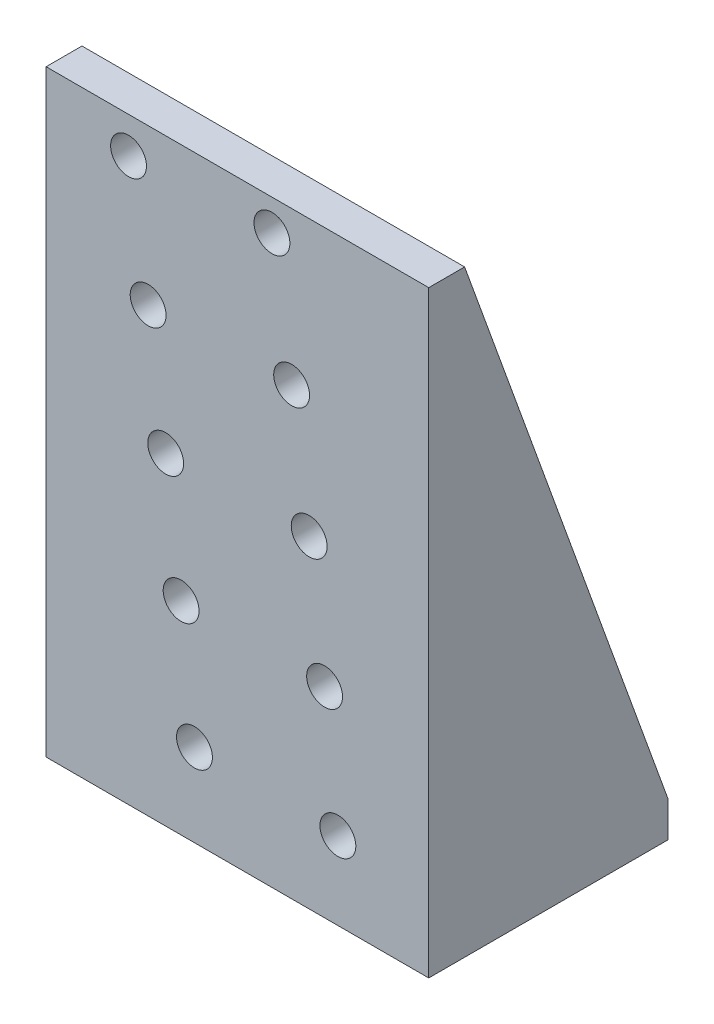
ISO-10303-21;
HEADER;
FILE_DESCRIPTION(('STEP AP214'),'2;1');
FILE_NAME('part.step','',(''),(''),'','','');
FILE_SCHEMA(('AUTOMOTIVE_DESIGN { 1 0 10303 214 1 1 1 1 }'));
ENDSEC;
DATA;
#1=APPLICATION_CONTEXT('core data for automotive mechanical design processes');
#2=APPLICATION_PROTOCOL_DEFINITION('international standard','automotive_design',2000,#1);
#3=PRODUCT_CONTEXT('',#1,'mechanical');
#4=PRODUCT('Part','Part','',(#3));
#5=PRODUCT_RELATED_PRODUCT_CATEGORY('part','',(#4));
#6=PRODUCT_DEFINITION_FORMATION('','',#4);
#7=PRODUCT_DEFINITION_CONTEXT('part definition',#1,'design');
#8=PRODUCT_DEFINITION('design','',#6,#7);
#9=PRODUCT_DEFINITION_SHAPE('','',#8);
#10=(LENGTH_UNIT() NAMED_UNIT(*) SI_UNIT(.MILLI.,.METRE.));
#11=(NAMED_UNIT(*) PLANE_ANGLE_UNIT() SI_UNIT($,.RADIAN.));
#12=(NAMED_UNIT(*) SI_UNIT($,.STERADIAN.) SOLID_ANGLE_UNIT());
#13=UNCERTAINTY_MEASURE_WITH_UNIT(LENGTH_MEASURE(1.E-05),#10,'distance_accuracy_value','');
#14=(GEOMETRIC_REPRESENTATION_CONTEXT(3) GLOBAL_UNCERTAINTY_ASSIGNED_CONTEXT((#13)) GLOBAL_UNIT_ASSIGNED_CONTEXT((#10,
#11,#12)) REPRESENTATION_CONTEXT('',''));
#15=CARTESIAN_POINT('',(0.,0.,0.));
#16=DIRECTION('',(0.,0.,1.));
#17=DIRECTION('',(1.,0.,0.));
#18=AXIS2_PLACEMENT_3D('',#15,#16,#17);
#19=CARTESIAN_POINT('',(0.,0.,-3.));
#20=DIRECTION('',(0.,0.,-1.));
#21=DIRECTION('',(1.,0.,0.));
#22=AXIS2_PLACEMENT_3D('',#19,#20,#21);
#23=PLANE('',#22);
#24=CARTESIAN_POINT('',(-9.10672553053666,19.9841864417442,-3.));
#25=DIRECTION('',(0.,0.,1.));
#26=DIRECTION('',(1.,0.,0.));
#27=AXIS2_PLACEMENT_3D('',#24,#25,#26);
#28=CIRCLE('',#27,1.5);
#29=CARTESIAN_POINT('',(-7.60672553053666,19.9841864417442,-3.));
#30=VERTEX_POINT('',#29);
#31=EDGE_CURVE('E197',#30,#30,#28,.T.);
#32=ORIENTED_EDGE('',*,*,#31,.T.);
#33=EDGE_LOOP('',(#32));
#34=FACE_BOUND('',#33,.T.);
#35=CARTESIAN_POINT('',(8.40008487268782,-20.4992297331571,-3.));
#36=DIRECTION('',(0.,0.,1.));
#37=DIRECTION('',(-1.,0.,0.));
#38=AXIS2_PLACEMENT_3D('',#35,#36,#37);
#39=CIRCLE('',#38,1.5);
#40=CARTESIAN_POINT('',(6.90008487268781,-20.4992297331571,-3.));
#41=VERTEX_POINT('',#40);
#42=EDGE_CURVE('E209',#41,#41,#39,.T.);
#43=ORIENTED_EDGE('',*,*,#42,.T.);
#44=EDGE_LOOP('',(#43));
#45=FACE_BOUND('',#44,.T.);
#46=CARTESIAN_POINT('',(7.28948947019076,-10.2391422548933,-3.));
#47=DIRECTION('',(0.,0.,1.));
#48=DIRECTION('',(-1.,0.,0.));
#49=AXIS2_PLACEMENT_3D('',#46,#47,#48);
#50=CIRCLE('',#49,1.5);
#51=CARTESIAN_POINT('',(5.78948947019076,-10.2391422548933,-3.));
#52=VERTEX_POINT('',#51);
#53=EDGE_CURVE('E221',#52,#52,#50,.T.);
#54=ORIENTED_EDGE('',*,*,#53,.T.);
#55=EDGE_LOOP('',(#54));
#56=FACE_BOUND('',#55,.T.);
#57=CARTESIAN_POINT('',(-7.46616308877687,10.0056492123557,-3.));
#58=DIRECTION('',(0.,0.,1.));
#59=DIRECTION('',(1.,0.,0.));
#60=AXIS2_PLACEMENT_3D('',#57,#58,#59);
#61=CIRCLE('',#60,1.5);
#62=CARTESIAN_POINT('',(-5.96616308877687,10.0056492123557,-3.));
#63=VERTEX_POINT('',#62);
#64=EDGE_CURVE('E233',#63,#63,#61,.T.);
#65=ORIENTED_EDGE('',*,*,#64,.T.);
#66=EDGE_LOOP('',(#65));
#67=FACE_BOUND('',#66,.T.);
#68=CARTESIAN_POINT('',(-6.,0.,-3.));
#69=DIRECTION('',(0.,0.,1.));
#70=DIRECTION('',(1.,0.,0.));
#71=AXIS2_PLACEMENT_3D('',#68,#69,#70);
#72=CIRCLE('',#71,1.5);
#73=CARTESIAN_POINT('',(-4.5,0.,-3.));
#74=VERTEX_POINT('',#73);
#75=EDGE_CURVE('E245',#74,#74,#72,.T.);
#76=ORIENTED_EDGE('',*,*,#75,.T.);
#77=EDGE_LOOP('',(#76));
#78=FACE_BOUND('',#77,.T.);
#79=CARTESIAN_POINT('',(6.,0.,-3.));
#80=DIRECTION('',(0.,0.,1.));
#81=DIRECTION('',(-1.,0.,0.));
#82=AXIS2_PLACEMENT_3D('',#79,#80,#81);
#83=CIRCLE('',#82,1.5);
#84=CARTESIAN_POINT('',(4.5,0.,-3.));
#85=VERTEX_POINT('',#84);
#86=EDGE_CURVE('E239',#85,#85,#83,.T.);
#87=ORIENTED_EDGE('',*,*,#86,.T.);
#88=EDGE_LOOP('',(#87));
#89=FACE_BOUND('',#88,.T.);
#90=CARTESIAN_POINT('',(-4.70868287168593,-10.0297133776459,-3.));
#91=DIRECTION('',(0.,0.,1.));
#92=DIRECTION('',(1.,0.,0.));
#93=AXIS2_PLACEMENT_3D('',#90,#91,#92);
#94=CIRCLE('',#93,1.5);
#95=CARTESIAN_POINT('',(-3.20868287168593,-10.0297133776459,-3.));
#96=VERTEX_POINT('',#95);
#97=EDGE_CURVE('E227',#96,#96,#94,.T.);
#98=ORIENTED_EDGE('',*,*,#97,.T.);
#99=EDGE_LOOP('',(#98));
#100=FACE_BOUND('',#99,.T.);
#101=CARTESIAN_POINT('',(-3.59260505154133,-20.0804357727271,-3.));
#102=DIRECTION('',(0.,0.,1.));
#103=DIRECTION('',(1.,0.,0.));
#104=AXIS2_PLACEMENT_3D('',#101,#102,#103);
#105=CIRCLE('',#104,1.5);
#106=CARTESIAN_POINT('',(-2.09260505154133,-20.0804357727271,-3.));
#107=VERTEX_POINT('',#106);
#108=EDGE_CURVE('E215',#107,#107,#105,.T.);
#109=ORIENTED_EDGE('',*,*,#108,.T.);
#110=EDGE_LOOP('',(#109));
#111=FACE_BOUND('',#110,.T.);
#112=CARTESIAN_POINT('',(4.53200925309991,10.2150780896031,-3.));
#113=DIRECTION('',(0.,0.,1.));
#114=DIRECTION('',(-1.,0.,0.));
#115=AXIS2_PLACEMENT_3D('',#112,#113,#114);
#116=CIRCLE('',#115,1.5);
#117=CARTESIAN_POINT('',(3.03200925309991,10.2150780896031,-3.));
#118=VERTEX_POINT('',#117);
#119=EDGE_CURVE('E203',#118,#118,#116,.T.);
#120=ORIENTED_EDGE('',*,*,#119,.T.);
#121=EDGE_LOOP('',(#120));
#122=FACE_BOUND('',#121,.T.);
#123=CARTESIAN_POINT('',(2.88596439369254,20.4029804021742,-3.));
#124=DIRECTION('',(0.,0.,1.));
#125=DIRECTION('',(-1.,0.,0.));
#126=AXIS2_PLACEMENT_3D('',#123,#124,#125);
#127=CIRCLE('',#126,1.5);
#128=CARTESIAN_POINT('',(1.38596439369254,20.4029804021742,-3.));
#129=VERTEX_POINT('',#128);
#130=EDGE_CURVE('E191',#129,#129,#127,.T.);
#131=ORIENTED_EDGE('',*,*,#130,.T.);
#132=EDGE_LOOP('',(#131));
#133=FACE_BOUND('',#132,.T.);
#134=DIRECTION('',(1.,0.,0.));
#135=VECTOR('',#134,1.);
#136=CARTESIAN_POINT('',(0.,-24.,-3.));
#137=LINE('',#136,#135);
#138=CARTESIAN_POINT('',(-10.,-24.,-3.));
#139=VERTEX_POINT('',#138);
#140=CARTESIAN_POINT('',(10.,-24.,-3.));
#141=VERTEX_POINT('',#140);
#142=EDGE_CURVE('E185',#139,#141,#137,.T.);
#143=ORIENTED_EDGE('',*,*,#142,.F.);
#144=CARTESIAN_POINT('',(-10.,-21.,-3.));
#145=DIRECTION('',(0.,0.,1.));
#146=DIRECTION('',(1.,0.,0.));
#147=AXIS2_PLACEMENT_3D('',#144,#145,#146);
#148=CIRCLE('',#147,3.);
#149=CARTESIAN_POINT('',(-13.,-21.,-3.));
#150=VERTEX_POINT('',#149);
#151=EDGE_CURVE('E140',#150,#139,#148,.T.);
#152=ORIENTED_EDGE('',*,*,#151,.F.);
#153=DIRECTION('',(0.,-1.,0.));
#154=VECTOR('',#153,1.);
#155=CARTESIAN_POINT('',(-13.,0.,-3.));
#156=LINE('',#155,#154);
#157=CARTESIAN_POINT('',(-13.,23.,-3.));
#158=VERTEX_POINT('',#157);
#159=EDGE_CURVE('E111',#158,#150,#156,.T.);
#160=ORIENTED_EDGE('',*,*,#159,.F.);
#161=DIRECTION('',(-1.,0.,0.));
#162=VECTOR('',#161,1.);
#163=CARTESIAN_POINT('',(-16.,23.,-3.));
#164=LINE('',#163,#162);
#165=CARTESIAN_POINT('',(13.,23.,-3.));
#166=VERTEX_POINT('',#165);
#167=EDGE_CURVE('E129',#166,#158,#164,.T.);
#168=ORIENTED_EDGE('',*,*,#167,.F.);
#169=DIRECTION('',(0.,1.,0.));
#170=VECTOR('',#169,1.);
#171=CARTESIAN_POINT('',(13.,0.,-3.));
#172=LINE('',#171,#170);
#173=CARTESIAN_POINT('',(13.,-21.,-3.));
#174=VERTEX_POINT('',#173);
#175=EDGE_CURVE('E147',#174,#166,#172,.T.);
#176=ORIENTED_EDGE('',*,*,#175,.F.);
#177=CARTESIAN_POINT('',(10.,-21.,-3.));
#178=DIRECTION('',(0.,0.,1.));
#179=DIRECTION('',(1.,0.,0.));
#180=AXIS2_PLACEMENT_3D('',#177,#178,#179);
#181=CIRCLE('',#180,3.);
#182=EDGE_CURVE('E277',#141,#174,#181,.T.);
#183=ORIENTED_EDGE('',*,*,#182,.F.);
#184=EDGE_LOOP('',(#143,#152,#160,#168,#176,#183));
#185=FACE_BOUND('',#184,.T.);
#186=ADVANCED_FACE('F36',(#34,#45,#56,#67,#78,#89,#100,#111,#122,#133,#185),#23,.T.);
#187=CARTESIAN_POINT('',(0.,-24.,0.));
#188=DIRECTION('',(0.,-1.,0.));
#189=DIRECTION('',(0.,0.,1.));
#190=AXIS2_PLACEMENT_3D('',#187,#188,#189);
#191=PLANE('',#190);
#192=CARTESIAN_POINT('',(-7.,-24.,-9.));
#193=DIRECTION('',(0.,1.,0.));
#194=DIRECTION('',(0.,0.,-1.));
#195=AXIS2_PLACEMENT_3D('',#192,#193,#194);
#196=CIRCLE('',#195,1.5);
#197=CARTESIAN_POINT('',(-7.,-24.,-10.5));
#198=VERTEX_POINT('',#197);
#199=EDGE_CURVE('E152',#198,#198,#196,.T.);
#200=ORIENTED_EDGE('',*,*,#199,.F.);
#201=EDGE_LOOP('',(#200));
#202=FACE_BOUND('',#201,.T.);
#203=CARTESIAN_POINT('',(-7.,-24.,-17.));
#204=DIRECTION('',(0.,1.,0.));
#205=DIRECTION('',(0.,0.,-1.));
#206=AXIS2_PLACEMENT_3D('',#203,#204,#205);
#207=CIRCLE('',#206,1.5);
#208=CARTESIAN_POINT('',(-7.,-24.,-18.5));
#209=VERTEX_POINT('',#208);
#210=EDGE_CURVE('E158',#209,#209,#207,.T.);
#211=ORIENTED_EDGE('',*,*,#210,.F.);
#212=EDGE_LOOP('',(#211));
#213=FACE_BOUND('',#212,.T.);
#214=CARTESIAN_POINT('',(7.,-24.,-17.));
#215=DIRECTION('',(0.,1.,0.));
#216=DIRECTION('',(0.,0.,1.));
#217=AXIS2_PLACEMENT_3D('',#214,#215,#216);
#218=CIRCLE('',#217,1.5);
#219=CARTESIAN_POINT('',(7.,-24.,-15.5));
#220=VERTEX_POINT('',#219);
#221=EDGE_CURVE('E164',#220,#220,#218,.T.);
#222=ORIENTED_EDGE('',*,*,#221,.F.);
#223=EDGE_LOOP('',(#222));
#224=FACE_BOUND('',#223,.T.);
#225=CARTESIAN_POINT('',(7.,-24.,-9.));
#226=DIRECTION('',(0.,1.,0.));
#227=DIRECTION('',(0.,0.,1.));
#228=AXIS2_PLACEMENT_3D('',#225,#226,#227);
#229=CIRCLE('',#228,1.5);
#230=CARTESIAN_POINT('',(7.,-24.,-7.5));
#231=VERTEX_POINT('',#230);
#232=EDGE_CURVE('E170',#231,#231,#229,.T.);
#233=ORIENTED_EDGE('',*,*,#232,.F.);
#234=EDGE_LOOP('',(#233));
#235=FACE_BOUND('',#234,.T.);
#236=DIRECTION('',(-1.,0.,0.));
#237=VECTOR('',#236,1.);
#238=CARTESIAN_POINT('',(-16.,-24.,-20.));
#239=LINE('',#238,#237);
#240=CARTESIAN_POINT('',(10.,-24.,-20.));
#241=VERTEX_POINT('',#240);
#242=CARTESIAN_POINT('',(-10.,-24.,-20.));
#243=VERTEX_POINT('',#242);
#244=EDGE_CURVE('E179',#241,#243,#239,.T.);
#245=ORIENTED_EDGE('',*,*,#244,.T.);
#246=DIRECTION('',(0.,0.,1.));
#247=VECTOR('',#246,1.);
#248=CARTESIAN_POINT('',(-10.,-24.,-20.));
#249=LINE('',#248,#247);
#250=EDGE_CURVE('E271',#139,#243,#249,.F.);
#251=ORIENTED_EDGE('',*,*,#250,.F.);
#252=ORIENTED_EDGE('',*,*,#142,.T.);
#253=DIRECTION('',(0.,0.,-1.));
#254=VECTOR('',#253,1.);
#255=CARTESIAN_POINT('',(10.,-24.,-3.));
#256=LINE('',#255,#254);
#257=EDGE_CURVE('E274',#241,#141,#256,.F.);
#258=ORIENTED_EDGE('',*,*,#257,.F.);
#259=EDGE_LOOP('',(#245,#251,#252,#258));
#260=FACE_BOUND('',#259,.T.);
#261=ADVANCED_FACE('F289',(#202,#213,#224,#235,#260),#191,.F.);
#262=CARTESIAN_POINT('',(0.,0.,0.));
#263=DIRECTION('',(0.,0.,-1.));
#264=DIRECTION('',(1.,0.,0.));
#265=AXIS2_PLACEMENT_3D('',#262,#263,#264);
#266=PLANE('',#265);
#267=DIRECTION('',(0.,-1.,0.));
#268=VECTOR('',#267,1.);
#269=CARTESIAN_POINT('',(-16.,23.,0.));
#270=LINE('',#269,#268);
#271=CARTESIAN_POINT('',(-16.,23.,0.));
#272=VERTEX_POINT('',#271);
#273=CARTESIAN_POINT('',(-16.,-27.,0.));
#274=VERTEX_POINT('',#273);
#275=EDGE_CURVE('E257',#272,#274,#270,.T.);
#276=ORIENTED_EDGE('',*,*,#275,.T.);
#277=DIRECTION('',(1.,0.,0.));
#278=VECTOR('',#277,1.);
#279=CARTESIAN_POINT('',(-16.,-27.,0.));
#280=LINE('',#279,#278);
#281=CARTESIAN_POINT('',(16.,-27.,0.));
#282=VERTEX_POINT('',#281);
#283=EDGE_CURVE('E136',#274,#282,#280,.T.);
#284=ORIENTED_EDGE('',*,*,#283,.T.);
#285=DIRECTION('',(0.,1.,0.));
#286=VECTOR('',#285,1.);
#287=CARTESIAN_POINT('',(16.,23.,0.));
#288=LINE('',#287,#286);
#289=CARTESIAN_POINT('',(16.,23.,0.));
#290=VERTEX_POINT('',#289);
#291=EDGE_CURVE('E248',#282,#290,#288,.T.);
#292=ORIENTED_EDGE('',*,*,#291,.T.);
#293=DIRECTION('',(-1.,0.,0.));
#294=VECTOR('',#293,1.);
#295=CARTESIAN_POINT('',(-16.,23.,0.));
#296=LINE('',#295,#294);
#297=EDGE_CURVE('E254',#290,#272,#296,.T.);
#298=ORIENTED_EDGE('',*,*,#297,.T.);
#299=EDGE_LOOP('',(#276,#284,#292,#298));
#300=FACE_BOUND('',#299,.T.);
#301=CARTESIAN_POINT('',(2.88596439369254,20.4029804021742,0.));
#302=DIRECTION('',(0.,0.,1.));
#303=DIRECTION('',(-1.,0.,0.));
#304=AXIS2_PLACEMENT_3D('',#301,#302,#303);
#305=CIRCLE('',#304,1.5);
#306=CARTESIAN_POINT('',(1.38596439369254,20.4029804021742,0.));
#307=VERTEX_POINT('',#306);
#308=EDGE_CURVE('E190',#307,#307,#305,.T.);
#309=ORIENTED_EDGE('',*,*,#308,.F.);
#310=EDGE_LOOP('',(#309));
#311=FACE_BOUND('',#310,.T.);
#312=CARTESIAN_POINT('',(-9.10672553053666,19.9841864417442,0.));
#313=DIRECTION('',(0.,0.,1.));
#314=DIRECTION('',(1.,0.,0.));
#315=AXIS2_PLACEMENT_3D('',#312,#313,#314);
#316=CIRCLE('',#315,1.5);
#317=CARTESIAN_POINT('',(-7.60672553053666,19.9841864417442,0.));
#318=VERTEX_POINT('',#317);
#319=EDGE_CURVE('E194',#318,#318,#316,.T.);
#320=ORIENTED_EDGE('',*,*,#319,.F.);
#321=EDGE_LOOP('',(#320));
#322=FACE_BOUND('',#321,.T.);
#323=CARTESIAN_POINT('',(4.53200925309991,10.2150780896031,0.));
#324=DIRECTION('',(0.,0.,1.));
#325=DIRECTION('',(-1.,0.,0.));
#326=AXIS2_PLACEMENT_3D('',#323,#324,#325);
#327=CIRCLE('',#326,1.5);
#328=CARTESIAN_POINT('',(3.03200925309991,10.2150780896031,0.));
#329=VERTEX_POINT('',#328);
#330=EDGE_CURVE('E200',#329,#329,#327,.T.);
#331=ORIENTED_EDGE('',*,*,#330,.F.);
#332=EDGE_LOOP('',(#331));
#333=FACE_BOUND('',#332,.T.);
#334=CARTESIAN_POINT('',(8.40008487268782,-20.4992297331571,0.));
#335=DIRECTION('',(0.,0.,1.));
#336=DIRECTION('',(-1.,0.,0.));
#337=AXIS2_PLACEMENT_3D('',#334,#335,#336);
#338=CIRCLE('',#337,1.5);
#339=CARTESIAN_POINT('',(6.90008487268781,-20.4992297331571,0.));
#340=VERTEX_POINT('',#339);
#341=EDGE_CURVE('E206',#340,#340,#338,.T.);
#342=ORIENTED_EDGE('',*,*,#341,.F.);
#343=EDGE_LOOP('',(#342));
#344=FACE_BOUND('',#343,.T.);
#345=CARTESIAN_POINT('',(-3.59260505154133,-20.0804357727271,0.));
#346=DIRECTION('',(0.,0.,1.));
#347=DIRECTION('',(1.,0.,0.));
#348=AXIS2_PLACEMENT_3D('',#345,#346,#347);
#349=CIRCLE('',#348,1.5);
#350=CARTESIAN_POINT('',(-2.09260505154133,-20.0804357727271,0.));
#351=VERTEX_POINT('',#350);
#352=EDGE_CURVE('E212',#351,#351,#349,.T.);
#353=ORIENTED_EDGE('',*,*,#352,.F.);
#354=EDGE_LOOP('',(#353));
#355=FACE_BOUND('',#354,.T.);
#356=CARTESIAN_POINT('',(7.28948947019076,-10.2391422548933,0.));
#357=DIRECTION('',(0.,0.,1.));
#358=DIRECTION('',(-1.,0.,0.));
#359=AXIS2_PLACEMENT_3D('',#356,#357,#358);
#360=CIRCLE('',#359,1.5);
#361=CARTESIAN_POINT('',(5.78948947019076,-10.2391422548933,0.));
#362=VERTEX_POINT('',#361);
#363=EDGE_CURVE('E218',#362,#362,#360,.T.);
#364=ORIENTED_EDGE('',*,*,#363,.F.);
#365=EDGE_LOOP('',(#364));
#366=FACE_BOUND('',#365,.T.);
#367=CARTESIAN_POINT('',(-4.70868287168593,-10.0297133776459,0.));
#368=DIRECTION('',(0.,0.,1.));
#369=DIRECTION('',(1.,0.,0.));
#370=AXIS2_PLACEMENT_3D('',#367,#368,#369);
#371=CIRCLE('',#370,1.5);
#372=CARTESIAN_POINT('',(-3.20868287168593,-10.0297133776459,0.));
#373=VERTEX_POINT('',#372);
#374=EDGE_CURVE('E224',#373,#373,#371,.T.);
#375=ORIENTED_EDGE('',*,*,#374,.F.);
#376=EDGE_LOOP('',(#375));
#377=FACE_BOUND('',#376,.T.);
#378=CARTESIAN_POINT('',(-7.46616308877687,10.0056492123557,0.));
#379=DIRECTION('',(0.,0.,1.));
#380=DIRECTION('',(1.,0.,0.));
#381=AXIS2_PLACEMENT_3D('',#378,#379,#380);
#382=CIRCLE('',#381,1.5);
#383=CARTESIAN_POINT('',(-5.96616308877687,10.0056492123557,0.));
#384=VERTEX_POINT('',#383);
#385=EDGE_CURVE('E230',#384,#384,#382,.T.);
#386=ORIENTED_EDGE('',*,*,#385,.F.);
#387=EDGE_LOOP('',(#386));
#388=FACE_BOUND('',#387,.T.);
#389=CARTESIAN_POINT('',(6.,0.,0.));
#390=DIRECTION('',(0.,0.,1.));
#391=DIRECTION('',(-1.,0.,0.));
#392=AXIS2_PLACEMENT_3D('',#389,#390,#391);
#393=CIRCLE('',#392,1.5);
#394=CARTESIAN_POINT('',(4.5,0.,0.));
#395=VERTEX_POINT('',#394);
#396=EDGE_CURVE('E236',#395,#395,#393,.T.);
#397=ORIENTED_EDGE('',*,*,#396,.F.);
#398=EDGE_LOOP('',(#397));
#399=FACE_BOUND('',#398,.T.);
#400=CARTESIAN_POINT('',(-6.,0.,0.));
#401=DIRECTION('',(0.,0.,1.));
#402=DIRECTION('',(1.,0.,0.));
#403=AXIS2_PLACEMENT_3D('',#400,#401,#402);
#404=CIRCLE('',#403,1.5);
#405=CARTESIAN_POINT('',(-4.5,0.,0.));
#406=VERTEX_POINT('',#405);
#407=EDGE_CURVE('E242',#406,#406,#404,.T.);
#408=ORIENTED_EDGE('',*,*,#407,.F.);
#409=EDGE_LOOP('',(#408));
#410=FACE_BOUND('',#409,.T.);
#411=ADVANCED_FACE('F312',(#300,#311,#322,#333,#344,#355,#366,#377,#388,#399,#410),#266,.F.);
#412=CARTESIAN_POINT('',(16.,23.,-3.));
#413=DIRECTION('',(-1.,0.,0.));
#414=DIRECTION('',(0.,-1.,0.));
#415=AXIS2_PLACEMENT_3D('',#412,#413,#414);
#416=PLANE('',#415);
#417=DIRECTION('',(0.,0.,1.));
#418=VECTOR('',#417,1.);
#419=CARTESIAN_POINT('',(16.,23.,-3.));
#420=LINE('',#419,#418);
#421=CARTESIAN_POINT('',(16.,23.,-3.));
#422=VERTEX_POINT('',#421);
#423=EDGE_CURVE('E267',#422,#290,#420,.T.);
#424=ORIENTED_EDGE('',*,*,#423,.T.);
#425=ORIENTED_EDGE('',*,*,#291,.F.);
#426=DIRECTION('',(0.,0.,1.));
#427=VECTOR('',#426,1.);
#428=CARTESIAN_POINT('',(16.,-27.,-3.));
#429=LINE('',#428,#427);
#430=CARTESIAN_POINT('',(16.,-27.,-20.));
#431=VERTEX_POINT('',#430);
#432=EDGE_CURVE('E251',#431,#282,#429,.T.);
#433=ORIENTED_EDGE('',*,*,#432,.F.);
#434=DIRECTION('',(0.,-1.,0.));
#435=VECTOR('',#434,1.);
#436=CARTESIAN_POINT('',(16.,-24.,-20.));
#437=LINE('',#436,#435);
#438=CARTESIAN_POINT('',(16.,-24.,-20.));
#439=VERTEX_POINT('',#438);
#440=EDGE_CURVE('E178',#439,#431,#437,.T.);
#441=ORIENTED_EDGE('',*,*,#440,.F.);
#442=DIRECTION('',(0.,-0.940376225750505,-0.340136081654438));
#443=VECTOR('',#442,1.);
#444=CARTESIAN_POINT('',(16.,23.,-3.));
#445=LINE('',#444,#443);
#446=EDGE_CURVE('E144',#422,#439,#445,.T.);
#447=ORIENTED_EDGE('',*,*,#446,.F.);
#448=EDGE_LOOP('',(#424,#425,#433,#441,#447));
#449=FACE_BOUND('',#448,.T.);
#450=ADVANCED_FACE('F301',(#449),#416,.F.);
#451=CARTESIAN_POINT('',(-16.,23.,-3.));
#452=DIRECTION('',(0.,-1.,0.));
#453=DIRECTION('',(0.,0.,1.));
#454=AXIS2_PLACEMENT_3D('',#451,#452,#453);
#455=PLANE('',#454);
#456=DIRECTION('',(1.,0.,0.));
#457=VECTOR('',#456,1.);
#458=CARTESIAN_POINT('',(-16.,23.,-3.));
#459=LINE('',#458,#457);
#460=CARTESIAN_POINT('',(-16.,23.,-3.));
#461=VERTEX_POINT('',#460);
#462=EDGE_CURVE('E119',#158,#461,#459,.F.);
#463=ORIENTED_EDGE('',*,*,#462,.T.);
#464=DIRECTION('',(0.,0.,1.));
#465=VECTOR('',#464,1.);
#466=CARTESIAN_POINT('',(-16.,23.,-3.));
#467=LINE('',#466,#465);
#468=EDGE_CURVE('E265',#461,#272,#467,.T.);
#469=ORIENTED_EDGE('',*,*,#468,.T.);
#470=ORIENTED_EDGE('',*,*,#297,.F.);
#471=ORIENTED_EDGE('',*,*,#423,.F.);
#472=EDGE_CURVE('E132',#422,#166,#164,.T.);
#473=ORIENTED_EDGE('',*,*,#472,.T.);
#474=ORIENTED_EDGE('',*,*,#167,.T.);
#475=EDGE_LOOP('',(#463,#469,#470,#471,#473,#474));
#476=FACE_BOUND('',#475,.T.);
#477=ADVANCED_FACE('F130',(#476),#455,.F.);
#478=CARTESIAN_POINT('',(-16.,23.,-3.));
#479=DIRECTION('',(1.,0.,0.));
#480=DIRECTION('',(0.,1.,0.));
#481=AXIS2_PLACEMENT_3D('',#478,#479,#480);
#482=PLANE('',#481);
#483=DIRECTION('',(0.,0.,1.));
#484=VECTOR('',#483,1.);
#485=CARTESIAN_POINT('',(-16.,-27.,-3.));
#486=LINE('',#485,#484);
#487=CARTESIAN_POINT('',(-16.,-27.,-20.));
#488=VERTEX_POINT('',#487);
#489=EDGE_CURVE('E263',#488,#274,#486,.T.);
#490=ORIENTED_EDGE('',*,*,#489,.T.);
#491=ORIENTED_EDGE('',*,*,#275,.F.);
#492=ORIENTED_EDGE('',*,*,#468,.F.);
#493=DIRECTION('',(0.,-0.940376225750505,-0.340136081654438));
#494=VECTOR('',#493,1.);
#495=CARTESIAN_POINT('',(-16.,23.,-3.));
#496=LINE('',#495,#494);
#497=CARTESIAN_POINT('',(-16.,-24.,-20.));
#498=VERTEX_POINT('',#497);
#499=EDGE_CURVE('E116',#461,#498,#496,.T.);
#500=ORIENTED_EDGE('',*,*,#499,.T.);
#501=DIRECTION('',(0.,-1.,0.));
#502=VECTOR('',#501,1.);
#503=CARTESIAN_POINT('',(-16.,-24.,-20.));
#504=LINE('',#503,#502);
#505=EDGE_CURVE('E182',#498,#488,#504,.T.);
#506=ORIENTED_EDGE('',*,*,#505,.T.);
#507=EDGE_LOOP('',(#490,#491,#492,#500,#506));
#508=FACE_BOUND('',#507,.T.);
#509=ADVANCED_FACE('F309',(#508),#482,.F.);
#510=CARTESIAN_POINT('',(-16.,-27.,-3.));
#511=DIRECTION('',(0.,1.,0.));
#512=DIRECTION('',(0.,0.,-1.));
#513=AXIS2_PLACEMENT_3D('',#510,#511,#512);
#514=PLANE('',#513);
#515=ORIENTED_EDGE('',*,*,#283,.F.);
#516=ORIENTED_EDGE('',*,*,#489,.F.);
#517=DIRECTION('',(-1.,0.,0.));
#518=VECTOR('',#517,1.);
#519=CARTESIAN_POINT('',(-16.,-27.,-20.));
#520=LINE('',#519,#518);
#521=EDGE_CURVE('E173',#431,#488,#520,.T.);
#522=ORIENTED_EDGE('',*,*,#521,.F.);
#523=ORIENTED_EDGE('',*,*,#432,.T.);
#524=EDGE_LOOP('',(#515,#516,#522,#523));
#525=FACE_BOUND('',#524,.T.);
#526=CARTESIAN_POINT('',(-7.,-27.,-9.));
#527=DIRECTION('',(0.,1.,0.));
#528=DIRECTION('',(0.,0.,-1.));
#529=AXIS2_PLACEMENT_3D('',#526,#527,#528);
#530=CIRCLE('',#529,1.5);
#531=CARTESIAN_POINT('',(-7.,-27.,-10.5));
#532=VERTEX_POINT('',#531);
#533=EDGE_CURVE('E151',#532,#532,#530,.T.);
#534=ORIENTED_EDGE('',*,*,#533,.T.);
#535=EDGE_LOOP('',(#534));
#536=FACE_BOUND('',#535,.T.);
#537=CARTESIAN_POINT('',(-7.,-27.,-17.));
#538=DIRECTION('',(0.,1.,0.));
#539=DIRECTION('',(0.,0.,-1.));
#540=AXIS2_PLACEMENT_3D('',#537,#538,#539);
#541=CIRCLE('',#540,1.5);
#542=CARTESIAN_POINT('',(-7.,-27.,-18.5));
#543=VERTEX_POINT('',#542);
#544=EDGE_CURVE('E155',#543,#543,#541,.T.);
#545=ORIENTED_EDGE('',*,*,#544,.T.);
#546=EDGE_LOOP('',(#545));
#547=FACE_BOUND('',#546,.T.);
#548=CARTESIAN_POINT('',(7.,-27.,-17.));
#549=DIRECTION('',(0.,1.,0.));
#550=DIRECTION('',(0.,0.,1.));
#551=AXIS2_PLACEMENT_3D('',#548,#549,#550);
#552=CIRCLE('',#551,1.5);
#553=CARTESIAN_POINT('',(7.,-27.,-15.5));
#554=VERTEX_POINT('',#553);
#555=EDGE_CURVE('E161',#554,#554,#552,.T.);
#556=ORIENTED_EDGE('',*,*,#555,.T.);
#557=EDGE_LOOP('',(#556));
#558=FACE_BOUND('',#557,.T.);
#559=CARTESIAN_POINT('',(7.,-27.,-9.));
#560=DIRECTION('',(0.,1.,0.));
#561=DIRECTION('',(0.,0.,1.));
#562=AXIS2_PLACEMENT_3D('',#559,#560,#561);
#563=CIRCLE('',#562,1.5);
#564=CARTESIAN_POINT('',(7.,-27.,-7.5));
#565=VERTEX_POINT('',#564);
#566=EDGE_CURVE('E167',#565,#565,#563,.T.);
#567=ORIENTED_EDGE('',*,*,#566,.T.);
#568=EDGE_LOOP('',(#567));
#569=FACE_BOUND('',#568,.T.);
#570=ADVANCED_FACE('F304',(#525,#536,#547,#558,#569),#514,.F.);
#571=CARTESIAN_POINT('',(-6.,0.,-3.));
#572=DIRECTION('',(0.,0.,1.));
#573=DIRECTION('',(-1.,0.,0.));
#574=AXIS2_PLACEMENT_3D('',#571,#572,#573);
#575=CYLINDRICAL_SURFACE('',#574,1.5);
#576=ORIENTED_EDGE('',*,*,#75,.F.);
#577=EDGE_LOOP('',(#576));
#578=FACE_BOUND('',#577,.T.);
#579=ORIENTED_EDGE('',*,*,#407,.T.);
#580=EDGE_LOOP('',(#579));
#581=FACE_BOUND('',#580,.T.);
#582=ADVANCED_FACE('F336',(#578,#581),#575,.F.);
#583=CARTESIAN_POINT('',(6.,0.,-3.));
#584=DIRECTION('',(0.,0.,1.));
#585=DIRECTION('',(-1.,0.,0.));
#586=AXIS2_PLACEMENT_3D('',#583,#584,#585);
#587=CYLINDRICAL_SURFACE('',#586,1.5);
#588=ORIENTED_EDGE('',*,*,#86,.F.);
#589=EDGE_LOOP('',(#588));
#590=FACE_BOUND('',#589,.T.);
#591=ORIENTED_EDGE('',*,*,#396,.T.);
#592=EDGE_LOOP('',(#591));
#593=FACE_BOUND('',#592,.T.);
#594=ADVANCED_FACE('F338',(#590,#593),#587,.F.);
#595=CARTESIAN_POINT('',(-7.46616308877687,10.0056492123557,-3.));
#596=DIRECTION('',(0.,0.,1.));
#597=DIRECTION('',(-1.,0.,0.));
#598=AXIS2_PLACEMENT_3D('',#595,#596,#597);
#599=CYLINDRICAL_SURFACE('',#598,1.5);
#600=ORIENTED_EDGE('',*,*,#64,.F.);
#601=EDGE_LOOP('',(#600));
#602=FACE_BOUND('',#601,.T.);
#603=ORIENTED_EDGE('',*,*,#385,.T.);
#604=EDGE_LOOP('',(#603));
#605=FACE_BOUND('',#604,.T.);
#606=ADVANCED_FACE('F345',(#602,#605),#599,.F.);
#607=CARTESIAN_POINT('',(-4.70868287168593,-10.0297133776459,-3.));
#608=DIRECTION('',(0.,0.,1.));
#609=DIRECTION('',(-1.,0.,0.));
#610=AXIS2_PLACEMENT_3D('',#607,#608,#609);
#611=CYLINDRICAL_SURFACE('',#610,1.5);
#612=ORIENTED_EDGE('',*,*,#97,.F.);
#613=EDGE_LOOP('',(#612));
#614=FACE_BOUND('',#613,.T.);
#615=ORIENTED_EDGE('',*,*,#374,.T.);
#616=EDGE_LOOP('',(#615));
#617=FACE_BOUND('',#616,.T.);
#618=ADVANCED_FACE('F421',(#614,#617),#611,.F.);
#619=CARTESIAN_POINT('',(7.28948947019076,-10.2391422548933,-3.));
#620=DIRECTION('',(0.,0.,1.));
#621=DIRECTION('',(-1.,0.,0.));
#622=AXIS2_PLACEMENT_3D('',#619,#620,#621);
#623=CYLINDRICAL_SURFACE('',#622,1.5);
#624=ORIENTED_EDGE('',*,*,#53,.F.);
#625=EDGE_LOOP('',(#624));
#626=FACE_BOUND('',#625,.T.);
#627=ORIENTED_EDGE('',*,*,#363,.T.);
#628=EDGE_LOOP('',(#627));
#629=FACE_BOUND('',#628,.T.);
#630=ADVANCED_FACE('F417',(#626,#629),#623,.F.);
#631=CARTESIAN_POINT('',(-3.59260505154133,-20.0804357727271,-3.));
#632=DIRECTION('',(0.,0.,1.));
#633=DIRECTION('',(-1.,0.,0.));
#634=AXIS2_PLACEMENT_3D('',#631,#632,#633);
#635=CYLINDRICAL_SURFACE('',#634,1.5);
#636=ORIENTED_EDGE('',*,*,#108,.F.);
#637=EDGE_LOOP('',(#636));
#638=FACE_BOUND('',#637,.T.);
#639=ORIENTED_EDGE('',*,*,#352,.T.);
#640=EDGE_LOOP('',(#639));
#641=FACE_BOUND('',#640,.T.);
#642=ADVANCED_FACE('F413',(#638,#641),#635,.F.);
#643=CARTESIAN_POINT('',(8.40008487268782,-20.4992297331571,-3.));
#644=DIRECTION('',(0.,0.,1.));
#645=DIRECTION('',(-1.,0.,0.));
#646=AXIS2_PLACEMENT_3D('',#643,#644,#645);
#647=CYLINDRICAL_SURFACE('',#646,1.5);
#648=ORIENTED_EDGE('',*,*,#42,.F.);
#649=EDGE_LOOP('',(#648));
#650=FACE_BOUND('',#649,.T.);
#651=ORIENTED_EDGE('',*,*,#341,.T.);
#652=EDGE_LOOP('',(#651));
#653=FACE_BOUND('',#652,.T.);
#654=ADVANCED_FACE('F409',(#650,#653),#647,.F.);
#655=CARTESIAN_POINT('',(4.53200925309991,10.2150780896031,-3.));
#656=DIRECTION('',(0.,0.,1.));
#657=DIRECTION('',(-1.,0.,0.));
#658=AXIS2_PLACEMENT_3D('',#655,#656,#657);
#659=CYLINDRICAL_SURFACE('',#658,1.5);
#660=ORIENTED_EDGE('',*,*,#119,.F.);
#661=EDGE_LOOP('',(#660));
#662=FACE_BOUND('',#661,.T.);
#663=ORIENTED_EDGE('',*,*,#330,.T.);
#664=EDGE_LOOP('',(#663));
#665=FACE_BOUND('',#664,.T.);
#666=ADVANCED_FACE('F405',(#662,#665),#659,.F.);
#667=CARTESIAN_POINT('',(-9.10672553053666,19.9841864417442,-3.));
#668=DIRECTION('',(0.,0.,1.));
#669=DIRECTION('',(-1.,0.,0.));
#670=AXIS2_PLACEMENT_3D('',#667,#668,#669);
#671=CYLINDRICAL_SURFACE('',#670,1.5);
#672=ORIENTED_EDGE('',*,*,#31,.F.);
#673=EDGE_LOOP('',(#672));
#674=FACE_BOUND('',#673,.T.);
#675=ORIENTED_EDGE('',*,*,#319,.T.);
#676=EDGE_LOOP('',(#675));
#677=FACE_BOUND('',#676,.T.);
#678=ADVANCED_FACE('F401',(#674,#677),#671,.F.);
#679=CARTESIAN_POINT('',(2.88596439369254,20.4029804021742,-3.));
#680=DIRECTION('',(0.,0.,1.));
#681=DIRECTION('',(-1.,0.,0.));
#682=AXIS2_PLACEMENT_3D('',#679,#680,#681);
#683=CYLINDRICAL_SURFACE('',#682,1.5);
#684=ORIENTED_EDGE('',*,*,#130,.F.);
#685=EDGE_LOOP('',(#684));
#686=FACE_BOUND('',#685,.T.);
#687=ORIENTED_EDGE('',*,*,#308,.T.);
#688=EDGE_LOOP('',(#687));
#689=FACE_BOUND('',#688,.T.);
#690=ADVANCED_FACE('F398',(#686,#689),#683,.F.);
#691=CARTESIAN_POINT('',(-16.,-24.,-20.));
#692=DIRECTION('',(0.,0.,-1.));
#693=DIRECTION('',(1.,0.,0.));
#694=AXIS2_PLACEMENT_3D('',#691,#692,#693);
#695=PLANE('',#694);
#696=ORIENTED_EDGE('',*,*,#505,.F.);
#697=EDGE_CURVE('E180',#243,#498,#239,.T.);
#698=ORIENTED_EDGE('',*,*,#697,.F.);
#699=ORIENTED_EDGE('',*,*,#244,.F.);
#700=EDGE_CURVE('E176',#439,#241,#239,.T.);
#701=ORIENTED_EDGE('',*,*,#700,.F.);
#702=ORIENTED_EDGE('',*,*,#440,.T.);
#703=ORIENTED_EDGE('',*,*,#521,.T.);
#704=EDGE_LOOP('',(#696,#698,#699,#701,#702,#703));
#705=FACE_BOUND('',#704,.T.);
#706=ADVANCED_FACE('F286',(#705),#695,.T.);
#707=CARTESIAN_POINT('',(7.,-24.,-9.));
#708=DIRECTION('',(0.,-1.,0.));
#709=DIRECTION('',(0.,0.,1.));
#710=AXIS2_PLACEMENT_3D('',#707,#708,#709);
#711=CYLINDRICAL_SURFACE('',#710,1.5);
#712=ORIENTED_EDGE('',*,*,#232,.T.);
#713=EDGE_LOOP('',(#712));
#714=FACE_BOUND('',#713,.T.);
#715=ORIENTED_EDGE('',*,*,#566,.F.);
#716=EDGE_LOOP('',(#715));
#717=FACE_BOUND('',#716,.T.);
#718=ADVANCED_FACE('F391',(#714,#717),#711,.F.);
#719=CARTESIAN_POINT('',(7.,-24.,-17.));
#720=DIRECTION('',(0.,-1.,0.));
#721=DIRECTION('',(0.,0.,1.));
#722=AXIS2_PLACEMENT_3D('',#719,#720,#721);
#723=CYLINDRICAL_SURFACE('',#722,1.5);
#724=ORIENTED_EDGE('',*,*,#221,.T.);
#725=EDGE_LOOP('',(#724));
#726=FACE_BOUND('',#725,.T.);
#727=ORIENTED_EDGE('',*,*,#555,.F.);
#728=EDGE_LOOP('',(#727));
#729=FACE_BOUND('',#728,.T.);
#730=ADVANCED_FACE('F387',(#726,#729),#723,.F.);
#731=CARTESIAN_POINT('',(-7.,-24.,-17.));
#732=DIRECTION('',(0.,-1.,0.));
#733=DIRECTION('',(0.,0.,1.));
#734=AXIS2_PLACEMENT_3D('',#731,#732,#733);
#735=CYLINDRICAL_SURFACE('',#734,1.5);
#736=ORIENTED_EDGE('',*,*,#210,.T.);
#737=EDGE_LOOP('',(#736));
#738=FACE_BOUND('',#737,.T.);
#739=ORIENTED_EDGE('',*,*,#544,.F.);
#740=EDGE_LOOP('',(#739));
#741=FACE_BOUND('',#740,.T.);
#742=ADVANCED_FACE('F383',(#738,#741),#735,.F.);
#743=CARTESIAN_POINT('',(-7.,-24.,-9.));
#744=DIRECTION('',(0.,-1.,0.));
#745=DIRECTION('',(0.,0.,1.));
#746=AXIS2_PLACEMENT_3D('',#743,#744,#745);
#747=CYLINDRICAL_SURFACE('',#746,1.5);
#748=ORIENTED_EDGE('',*,*,#199,.T.);
#749=EDGE_LOOP('',(#748));
#750=FACE_BOUND('',#749,.T.);
#751=ORIENTED_EDGE('',*,*,#533,.F.);
#752=EDGE_LOOP('',(#751));
#753=FACE_BOUND('',#752,.T.);
#754=ADVANCED_FACE('F380',(#750,#753),#747,.F.);
#755=CARTESIAN_POINT('',(16.,23.,-3.));
#756=DIRECTION('',(0.,0.340136081654438,-0.940376225750506));
#757=DIRECTION('',(0.,-0.940376225750505,-0.340136081654438));
#758=AXIS2_PLACEMENT_3D('',#755,#756,#757);
#759=PLANE('',#758);
#760=ORIENTED_EDGE('',*,*,#446,.T.);
#761=ORIENTED_EDGE('',*,*,#700,.T.);
#762=CARTESIAN_POINT('',(10.,-21.,-18.9148936170213));
#763=DIRECTION('',(0.,-0.340136081654438,0.940376225750506));
#764=DIRECTION('',(0.,0.940376225750506,0.340136081654438));
#765=AXIS2_PLACEMENT_3D('',#762,#763,#764);
#766=ELLIPSE('',#765,3.19021251053612,3.);
#767=CARTESIAN_POINT('',(13.,-21.,-18.9148936170213));
#768=VERTEX_POINT('',#767);
#769=EDGE_CURVE('E45',#768,#241,#766,.F.);
#770=ORIENTED_EDGE('',*,*,#769,.F.);
#771=DIRECTION('',(0.,-0.940376225750505,-0.340136081654438));
#772=VECTOR('',#771,1.);
#773=CARTESIAN_POINT('',(13.,23.,-3.));
#774=LINE('',#773,#772);
#775=EDGE_CURVE('E125',#166,#768,#774,.T.);
#776=ORIENTED_EDGE('',*,*,#775,.F.);
#777=ORIENTED_EDGE('',*,*,#472,.F.);
#778=EDGE_LOOP('',(#760,#761,#770,#776,#777));
#779=FACE_BOUND('',#778,.T.);
#780=ADVANCED_FACE('F295',(#779),#759,.T.);
#781=CARTESIAN_POINT('',(13.,-2.,-10.));
#782=DIRECTION('',(1.,0.,0.));
#783=DIRECTION('',(0.,1.,0.));
#784=AXIS2_PLACEMENT_3D('',#781,#782,#783);
#785=PLANE('',#784);
#786=ORIENTED_EDGE('',*,*,#175,.T.);
#787=ORIENTED_EDGE('',*,*,#775,.T.);
#788=DIRECTION('',(0.,0.,-1.));
#789=VECTOR('',#788,1.);
#790=CARTESIAN_POINT('',(13.,-21.,-20.));
#791=LINE('',#790,#789);
#792=EDGE_CURVE('E269',#174,#768,#791,.T.);
#793=ORIENTED_EDGE('',*,*,#792,.F.);
#794=EDGE_LOOP('',(#786,#787,#793));
#795=FACE_BOUND('',#794,.T.);
#796=ADVANCED_FACE('F293',(#795),#785,.F.);
#797=CARTESIAN_POINT('',(-16.,23.,-3.));
#798=DIRECTION('',(0.,-0.340136081654438,0.940376225750506));
#799=DIRECTION('',(0.,-0.940376225750505,-0.340136081654438));
#800=AXIS2_PLACEMENT_3D('',#797,#798,#799);
#801=PLANE('',#800);
#802=DIRECTION('',(0.,-0.940376225750505,-0.340136081654438));
#803=VECTOR('',#802,1.);
#804=CARTESIAN_POINT('',(-13.,23.,-3.));
#805=LINE('',#804,#803);
#806=CARTESIAN_POINT('',(-13.,-21.,-18.9148936170213));
#807=VERTEX_POINT('',#806);
#808=EDGE_CURVE('E107',#158,#807,#805,.T.);
#809=ORIENTED_EDGE('',*,*,#808,.T.);
#810=CARTESIAN_POINT('',(-10.,-21.,-18.9148936170213));
#811=DIRECTION('',(0.,0.340136081654438,-0.940376225750506));
#812=DIRECTION('',(0.,-0.940376225750506,-0.340136081654438));
#813=AXIS2_PLACEMENT_3D('',#810,#811,#812);
#814=ELLIPSE('',#813,3.19021251053612,3.);
#815=EDGE_CURVE('E11',#243,#807,#814,.T.);
#816=ORIENTED_EDGE('',*,*,#815,.F.);
#817=ORIENTED_EDGE('',*,*,#697,.T.);
#818=ORIENTED_EDGE('',*,*,#499,.F.);
#819=ORIENTED_EDGE('',*,*,#462,.F.);
#820=EDGE_LOOP('',(#809,#816,#817,#818,#819));
#821=FACE_BOUND('',#820,.T.);
#822=ADVANCED_FACE('F121',(#821),#801,.F.);
#823=CARTESIAN_POINT('',(-13.,-2.,-10.));
#824=DIRECTION('',(-1.,0.,0.));
#825=DIRECTION('',(0.,-1.,0.));
#826=AXIS2_PLACEMENT_3D('',#823,#824,#825);
#827=PLANE('',#826);
#828=ORIENTED_EDGE('',*,*,#808,.F.);
#829=ORIENTED_EDGE('',*,*,#159,.T.);
#830=DIRECTION('',(0.,0.,1.));
#831=VECTOR('',#830,1.);
#832=CARTESIAN_POINT('',(-13.,-21.,-3.));
#833=LINE('',#832,#831);
#834=EDGE_CURVE('E113',#807,#150,#833,.T.);
#835=ORIENTED_EDGE('',*,*,#834,.F.);
#836=EDGE_LOOP('',(#828,#829,#835));
#837=FACE_BOUND('',#836,.T.);
#838=ADVANCED_FACE('F109',(#837),#827,.F.);
#839=CARTESIAN_POINT('',(10.,-21.,-10.));
#840=DIRECTION('',(0.,0.,1.));
#841=DIRECTION('',(-1.,0.,0.));
#842=AXIS2_PLACEMENT_3D('',#839,#840,#841);
#843=CYLINDRICAL_SURFACE('',#842,3.);
#844=ORIENTED_EDGE('',*,*,#182,.T.);
#845=ORIENTED_EDGE('',*,*,#792,.T.);
#846=ORIENTED_EDGE('',*,*,#769,.T.);
#847=ORIENTED_EDGE('',*,*,#257,.T.);
#848=EDGE_LOOP('',(#844,#845,#846,#847));
#849=FACE_BOUND('',#848,.T.);
#850=ADVANCED_FACE('F291',(#849),#843,.F.);
#851=CARTESIAN_POINT('',(-10.,-21.,-10.));
#852=DIRECTION('',(0.,0.,-1.));
#853=DIRECTION('',(1.,0.,0.));
#854=AXIS2_PLACEMENT_3D('',#851,#852,#853);
#855=CYLINDRICAL_SURFACE('',#854,3.);
#856=ORIENTED_EDGE('',*,*,#815,.T.);
#857=ORIENTED_EDGE('',*,*,#834,.T.);
#858=ORIENTED_EDGE('',*,*,#151,.T.);
#859=ORIENTED_EDGE('',*,*,#250,.T.);
#860=EDGE_LOOP('',(#856,#857,#858,#859));
#861=FACE_BOUND('',#860,.T.);
#862=ADVANCED_FACE('F38',(#861),#855,.F.);
#863=CLOSED_SHELL('',(#186,#261,#411,#450,#477,#509,#570,#582,#594,#606,#618,#630,#642,#654,
#666,#678,#690,#706,#718,#730,#742,#754,#780,#796,#822,#838,#850,#862));
#864=MANIFOLD_SOLID_BREP('B2',#863);
#865=ADVANCED_BREP_SHAPE_REPRESENTATION('',(#18,#864),#14);
#866=SHAPE_DEFINITION_REPRESENTATION(#9,#865);
ENDSEC;
END-ISO-10303-21;
